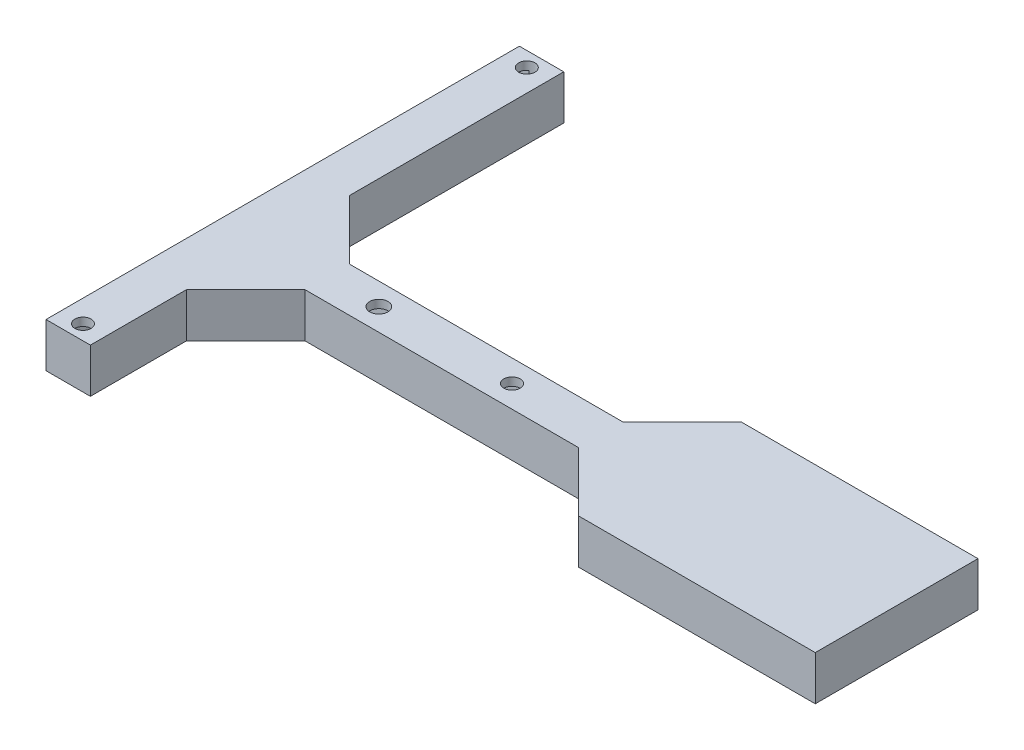
ISO-10303-21;
HEADER;
FILE_DESCRIPTION(('STEP AP214'),'2;1');
FILE_NAME('part.step','',(''),(''),'','','');
FILE_SCHEMA(('AUTOMOTIVE_DESIGN { 1 0 10303 214 1 1 1 1 }'));
ENDSEC;
DATA;
#1=APPLICATION_CONTEXT('core data for automotive mechanical design processes');
#2=APPLICATION_PROTOCOL_DEFINITION('international standard','automotive_design',2000,#1);
#3=PRODUCT_CONTEXT('',#1,'mechanical');
#4=PRODUCT('Part','Part','',(#3));
#5=PRODUCT_RELATED_PRODUCT_CATEGORY('part','',(#4));
#6=PRODUCT_DEFINITION_FORMATION('','',#4);
#7=PRODUCT_DEFINITION_CONTEXT('part definition',#1,'design');
#8=PRODUCT_DEFINITION('design','',#6,#7);
#9=PRODUCT_DEFINITION_SHAPE('','',#8);
#10=(LENGTH_UNIT() NAMED_UNIT(*) SI_UNIT(.MILLI.,.METRE.));
#11=(NAMED_UNIT(*) PLANE_ANGLE_UNIT() SI_UNIT($,.RADIAN.));
#12=(NAMED_UNIT(*) SI_UNIT($,.STERADIAN.) SOLID_ANGLE_UNIT());
#13=UNCERTAINTY_MEASURE_WITH_UNIT(LENGTH_MEASURE(1.E-05),#10,'distance_accuracy_value','');
#14=(GEOMETRIC_REPRESENTATION_CONTEXT(3) GLOBAL_UNCERTAINTY_ASSIGNED_CONTEXT((#13)) GLOBAL_UNIT_ASSIGNED_CONTEXT((#10,
#11,#12)) REPRESENTATION_CONTEXT('',''));
#15=CARTESIAN_POINT('',(0.,0.,0.));
#16=DIRECTION('',(0.,0.,1.));
#17=DIRECTION('',(1.,0.,0.));
#18=AXIS2_PLACEMENT_3D('',#15,#16,#17);
#19=CARTESIAN_POINT('',(0.,0.,0.));
#20=DIRECTION('',(0.,-1.,0.));
#21=DIRECTION('',(0.,0.,-1.));
#22=AXIS2_PLACEMENT_3D('',#19,#20,#21);
#23=PLANE('',#22);
#24=DIRECTION('',(-1.,0.,0.));
#25=VECTOR('',#24,1.);
#26=CARTESIAN_POINT('',(-80.,0.,-7.49999999999999));
#27=LINE('',#26,#25);
#28=CARTESIAN_POINT('',(-100.,0.,-7.49999999999999));
#29=VERTEX_POINT('',#28);
#30=CARTESIAN_POINT('',(-192.5,0.,-7.49999999999998));
#31=VERTEX_POINT('',#30);
#32=EDGE_CURVE('E343',#29,#31,#27,.T.);
#33=ORIENTED_EDGE('',*,*,#32,.F.);
#34=DIRECTION('',(-0.707106781186551,0.,0.707106781186544));
#35=VECTOR('',#34,1.);
#36=CARTESIAN_POINT('',(-100.,0.,-7.49999999999999));
#37=LINE('',#36,#35);
#38=CARTESIAN_POINT('',(-80.,0.,-27.5));
#39=VERTEX_POINT('',#38);
#40=EDGE_CURVE('E300',#29,#39,#37,.F.);
#41=ORIENTED_EDGE('',*,*,#40,.T.);
#42=DIRECTION('',(-1.,0.,0.));
#43=VECTOR('',#42,1.);
#44=CARTESIAN_POINT('',(-80.,0.,-27.5));
#45=LINE('',#44,#43);
#46=CARTESIAN_POINT('',(0.,0.,-27.5));
#47=VERTEX_POINT('',#46);
#48=EDGE_CURVE('E385',#47,#39,#45,.T.);
#49=ORIENTED_EDGE('',*,*,#48,.F.);
#50=DIRECTION('',(0.,0.,-1.));
#51=VECTOR('',#50,1.);
#52=CARTESIAN_POINT('',(0.,0.,-27.5));
#53=LINE('',#52,#51);
#54=CARTESIAN_POINT('',(0.,0.,27.5));
#55=VERTEX_POINT('',#54);
#56=EDGE_CURVE('E382',#55,#47,#53,.T.);
#57=ORIENTED_EDGE('',*,*,#56,.F.);
#58=DIRECTION('',(1.,0.,0.));
#59=VECTOR('',#58,1.);
#60=CARTESIAN_POINT('',(0.,0.,27.5));
#61=LINE('',#60,#59);
#62=CARTESIAN_POINT('',(-80.,0.,27.5));
#63=VERTEX_POINT('',#62);
#64=EDGE_CURVE('E378',#63,#55,#61,.T.);
#65=ORIENTED_EDGE('',*,*,#64,.F.);
#66=DIRECTION('',(0.707106781186544,0.,0.707106781186551));
#67=VECTOR('',#66,1.);
#68=CARTESIAN_POINT('',(-80.,0.,27.5000000000001));
#69=LINE('',#68,#67);
#70=CARTESIAN_POINT('',(-99.9999999999999,0.,7.50000000000002));
#71=VERTEX_POINT('',#70);
#72=EDGE_CURVE('E306',#63,#71,#69,.F.);
#73=ORIENTED_EDGE('',*,*,#72,.T.);
#74=DIRECTION('',(1.,0.,0.));
#75=VECTOR('',#74,1.);
#76=CARTESIAN_POINT('',(-80.,0.,7.50000000000002));
#77=LINE('',#76,#75);
#78=CARTESIAN_POINT('',(-192.5,0.,7.50000000000003));
#79=VERTEX_POINT('',#78);
#80=EDGE_CURVE('E374',#79,#71,#77,.T.);
#81=ORIENTED_EDGE('',*,*,#80,.F.);
#82=DIRECTION('',(0.707106781186551,0.,-0.707106781186544));
#83=VECTOR('',#82,1.);
#84=CARTESIAN_POINT('',(-192.5,0.,7.50000000000003));
#85=LINE('',#84,#83);
#86=CARTESIAN_POINT('',(-212.5,0.,27.5));
#87=VERTEX_POINT('',#86);
#88=EDGE_CURVE('E55',#79,#87,#85,.F.);
#89=ORIENTED_EDGE('',*,*,#88,.T.);
#90=DIRECTION('',(0.,0.,-1.));
#91=VECTOR('',#90,1.);
#92=CARTESIAN_POINT('',(-212.5,0.,7.50000000000003));
#93=LINE('',#92,#91);
#94=CARTESIAN_POINT('',(-212.5,0.,60.));
#95=VERTEX_POINT('',#94);
#96=EDGE_CURVE('E371',#95,#87,#93,.T.);
#97=ORIENTED_EDGE('',*,*,#96,.F.);
#98=DIRECTION('',(1.,0.,0.));
#99=VECTOR('',#98,1.);
#100=CARTESIAN_POINT('',(-212.5,0.,60.));
#101=LINE('',#100,#99);
#102=CARTESIAN_POINT('',(-227.5,0.,60.));
#103=VERTEX_POINT('',#102);
#104=EDGE_CURVE('E368',#103,#95,#101,.T.);
#105=ORIENTED_EDGE('',*,*,#104,.F.);
#106=DIRECTION('',(0.,0.,1.));
#107=VECTOR('',#106,1.);
#108=CARTESIAN_POINT('',(-227.5,0.,60.));
#109=LINE('',#108,#107);
#110=CARTESIAN_POINT('',(-227.5,0.,-100.));
#111=VERTEX_POINT('',#110);
#112=EDGE_CURVE('E365',#111,#103,#109,.T.);
#113=ORIENTED_EDGE('',*,*,#112,.F.);
#114=DIRECTION('',(-1.,0.,0.));
#115=VECTOR('',#114,1.);
#116=CARTESIAN_POINT('',(-227.5,0.,-100.));
#117=LINE('',#116,#115);
#118=CARTESIAN_POINT('',(-212.5,0.,-100.));
#119=VERTEX_POINT('',#118);
#120=EDGE_CURVE('E354',#119,#111,#117,.T.);
#121=ORIENTED_EDGE('',*,*,#120,.F.);
#122=DIRECTION('',(0.,0.,-1.));
#123=VECTOR('',#122,1.);
#124=CARTESIAN_POINT('',(-212.5,0.,-100.));
#125=LINE('',#124,#123);
#126=CARTESIAN_POINT('',(-212.5,0.,-27.5000000000002));
#127=VERTEX_POINT('',#126);
#128=EDGE_CURVE('E345',#127,#119,#125,.T.);
#129=ORIENTED_EDGE('',*,*,#128,.F.);
#130=DIRECTION('',(-0.707106781186543,0.,-0.707106781186552));
#131=VECTOR('',#130,1.);
#132=CARTESIAN_POINT('',(-212.5,0.,-27.5000000000001));
#133=LINE('',#132,#131);
#134=EDGE_CURVE('E312',#127,#31,#133,.F.);
#135=ORIENTED_EDGE('',*,*,#134,.T.);
#136=EDGE_LOOP('',(#33,#41,#49,#57,#65,#73,#81,#89,#97,#105,#113,#121,#129,#135));
#137=FACE_BOUND('',#136,.T.);
#138=DIRECTION('',(-1.,0.,0.));
#139=VECTOR('',#138,1.);
#140=CARTESIAN_POINT('',(0.,0.,-24.75));
#141=LINE('',#140,#139);
#142=CARTESIAN_POINT('',(-2.75000000000001,0.,-24.75));
#143=VERTEX_POINT('',#142);
#144=CARTESIAN_POINT('',(-77.25,0.,-24.75));
#145=VERTEX_POINT('',#144);
#146=EDGE_CURVE('E489',#143,#145,#141,.T.);
#147=ORIENTED_EDGE('',*,*,#146,.T.);
#148=DIRECTION('',(0.,0.,1.));
#149=VECTOR('',#148,1.);
#150=CARTESIAN_POINT('',(-77.25,0.,0.));
#151=LINE('',#150,#149);
#152=CARTESIAN_POINT('',(-77.25,0.,-4.74999999999999));
#153=VERTEX_POINT('',#152);
#154=EDGE_CURVE('E453',#145,#153,#151,.T.);
#155=ORIENTED_EDGE('',*,*,#154,.T.);
#156=DIRECTION('',(-1.,0.,0.));
#157=VECTOR('',#156,1.);
#158=CARTESIAN_POINT('',(0.,0.,-4.74999999999999));
#159=LINE('',#158,#157);
#160=CARTESIAN_POINT('',(-215.25,0.,-4.74999999999998));
#161=VERTEX_POINT('',#160);
#162=EDGE_CURVE('E448',#153,#161,#159,.T.);
#163=ORIENTED_EDGE('',*,*,#162,.T.);
#164=DIRECTION('',(0.,0.,-1.));
#165=VECTOR('',#164,1.);
#166=CARTESIAN_POINT('',(-215.25,0.,1.29175949216522E-13));
#167=LINE('',#166,#165);
#168=CARTESIAN_POINT('',(-215.25,0.,-97.25));
#169=VERTEX_POINT('',#168);
#170=EDGE_CURVE('E452',#161,#169,#167,.T.);
#171=ORIENTED_EDGE('',*,*,#170,.T.);
#172=DIRECTION('',(-1.,0.,0.));
#173=VECTOR('',#172,1.);
#174=CARTESIAN_POINT('',(0.,0.,-97.25));
#175=LINE('',#174,#173);
#176=CARTESIAN_POINT('',(-224.75,0.,-97.25));
#177=VERTEX_POINT('',#176);
#178=EDGE_CURVE('E457',#169,#177,#175,.T.);
#179=ORIENTED_EDGE('',*,*,#178,.T.);
#180=DIRECTION('',(0.,0.,1.));
#181=VECTOR('',#180,1.);
#182=CARTESIAN_POINT('',(-224.75,0.,0.));
#183=LINE('',#182,#181);
#184=CARTESIAN_POINT('',(-224.75,0.,57.25));
#185=VERTEX_POINT('',#184);
#186=EDGE_CURVE('E461',#177,#185,#183,.T.);
#187=ORIENTED_EDGE('',*,*,#186,.T.);
#188=DIRECTION('',(1.,0.,0.));
#189=VECTOR('',#188,1.);
#190=CARTESIAN_POINT('',(0.,0.,57.25));
#191=LINE('',#190,#189);
#192=CARTESIAN_POINT('',(-215.25,0.,57.25));
#193=VERTEX_POINT('',#192);
#194=EDGE_CURVE('E465',#185,#193,#191,.T.);
#195=ORIENTED_EDGE('',*,*,#194,.T.);
#196=DIRECTION('',(0.,0.,-1.));
#197=VECTOR('',#196,1.);
#198=CARTESIAN_POINT('',(-215.25,0.,0.));
#199=LINE('',#198,#197);
#200=CARTESIAN_POINT('',(-215.25,0.,4.75000000000003));
#201=VERTEX_POINT('',#200);
#202=EDGE_CURVE('E469',#193,#201,#199,.T.);
#203=ORIENTED_EDGE('',*,*,#202,.T.);
#204=DIRECTION('',(1.,0.,0.));
#205=VECTOR('',#204,1.);
#206=CARTESIAN_POINT('',(0.,0.,4.75000000000001));
#207=LINE('',#206,#205);
#208=CARTESIAN_POINT('',(-77.25,0.,4.75000000000002));
#209=VERTEX_POINT('',#208);
#210=EDGE_CURVE('E473',#201,#209,#207,.T.);
#211=ORIENTED_EDGE('',*,*,#210,.T.);
#212=DIRECTION('',(0.,0.,1.));
#213=VECTOR('',#212,1.);
#214=CARTESIAN_POINT('',(-77.25,0.,0.));
#215=LINE('',#214,#213);
#216=CARTESIAN_POINT('',(-77.25,0.,24.75));
#217=VERTEX_POINT('',#216);
#218=EDGE_CURVE('E477',#209,#217,#215,.T.);
#219=ORIENTED_EDGE('',*,*,#218,.T.);
#220=DIRECTION('',(1.,0.,0.));
#221=VECTOR('',#220,1.);
#222=CARTESIAN_POINT('',(0.,0.,24.75));
#223=LINE('',#222,#221);
#224=CARTESIAN_POINT('',(-2.74999999999999,0.,24.75));
#225=VERTEX_POINT('',#224);
#226=EDGE_CURVE('E481',#217,#225,#223,.T.);
#227=ORIENTED_EDGE('',*,*,#226,.T.);
#228=DIRECTION('',(0.,0.,-1.));
#229=VECTOR('',#228,1.);
#230=CARTESIAN_POINT('',(-2.75,0.,0.));
#231=LINE('',#230,#229);
#232=EDGE_CURVE('E485',#225,#143,#231,.T.);
#233=ORIENTED_EDGE('',*,*,#232,.T.);
#234=EDGE_LOOP('',(#147,#155,#163,#171,#179,#187,#195,#203,#211,#219,#227,#233));
#235=FACE_BOUND('',#234,.T.);
#236=ADVANCED_FACE('F45',(#137,#235),#23,.T.);
#237=CARTESIAN_POINT('',(-80.,15.,-7.49999999999999));
#238=DIRECTION('',(0.,0.,1.));
#239=DIRECTION('',(1.,0.,0.));
#240=AXIS2_PLACEMENT_3D('',#237,#238,#239);
#241=PLANE('',#240);
#242=DIRECTION('',(-1.,0.,0.));
#243=VECTOR('',#242,1.);
#244=CARTESIAN_POINT('',(-80.,15.,-7.49999999999999));
#245=LINE('',#244,#243);
#246=CARTESIAN_POINT('',(-100.,15.,-7.49999999999999));
#247=VERTEX_POINT('',#246);
#248=CARTESIAN_POINT('',(-192.5,15.,-7.49999999999998));
#249=VERTEX_POINT('',#248);
#250=EDGE_CURVE('E326',#247,#249,#245,.T.);
#251=ORIENTED_EDGE('',*,*,#250,.F.);
#252=DIRECTION('',(0.,-1.,0.));
#253=VECTOR('',#252,1.);
#254=CARTESIAN_POINT('',(-100.,0.,-7.49999999999999));
#255=LINE('',#254,#253);
#256=EDGE_CURVE('E283',#247,#29,#255,.T.);
#257=ORIENTED_EDGE('',*,*,#256,.T.);
#258=ORIENTED_EDGE('',*,*,#32,.T.);
#259=DIRECTION('',(0.,1.,0.));
#260=VECTOR('',#259,1.);
#261=CARTESIAN_POINT('',(-192.5,15.,-7.49999999999998));
#262=LINE('',#261,#260);
#263=EDGE_CURVE('E275',#31,#249,#262,.T.);
#264=ORIENTED_EDGE('',*,*,#263,.T.);
#265=EDGE_LOOP('',(#251,#257,#258,#264));
#266=FACE_BOUND('',#265,.T.);
#267=ADVANCED_FACE('F347',(#266),#241,.F.);
#268=CARTESIAN_POINT('',(-212.5,15.,-100.));
#269=DIRECTION('',(-1.,0.,0.));
#270=DIRECTION('',(0.,0.,1.));
#271=AXIS2_PLACEMENT_3D('',#268,#269,#270);
#272=PLANE('',#271);
#273=DIRECTION('',(0.,0.,-1.));
#274=VECTOR('',#273,1.);
#275=CARTESIAN_POINT('',(-212.5,15.,-100.));
#276=LINE('',#275,#274);
#277=CARTESIAN_POINT('',(-212.5,15.,-27.5000000000002));
#278=VERTEX_POINT('',#277);
#279=CARTESIAN_POINT('',(-212.5,15.,-100.));
#280=VERTEX_POINT('',#279);
#281=EDGE_CURVE('E323',#278,#280,#276,.T.);
#282=ORIENTED_EDGE('',*,*,#281,.F.);
#283=DIRECTION('',(0.,-1.,0.));
#284=VECTOR('',#283,1.);
#285=CARTESIAN_POINT('',(-212.5,0.,-27.5000000000002));
#286=LINE('',#285,#284);
#287=EDGE_CURVE('E294',#278,#127,#286,.T.);
#288=ORIENTED_EDGE('',*,*,#287,.T.);
#289=ORIENTED_EDGE('',*,*,#128,.T.);
#290=DIRECTION('',(0.,-1.,0.));
#291=VECTOR('',#290,1.);
#292=CARTESIAN_POINT('',(-212.5,15.,-100.));
#293=LINE('',#292,#291);
#294=EDGE_CURVE('E334',#280,#119,#293,.T.);
#295=ORIENTED_EDGE('',*,*,#294,.F.);
#296=EDGE_LOOP('',(#282,#288,#289,#295));
#297=FACE_BOUND('',#296,.T.);
#298=ADVANCED_FACE('F331',(#297),#272,.F.);
#299=CARTESIAN_POINT('',(-227.5,15.,-100.));
#300=DIRECTION('',(0.,0.,1.));
#301=DIRECTION('',(1.,0.,0.));
#302=AXIS2_PLACEMENT_3D('',#299,#300,#301);
#303=PLANE('',#302);
#304=ORIENTED_EDGE('',*,*,#120,.T.);
#305=DIRECTION('',(0.,-1.,0.));
#306=VECTOR('',#305,1.);
#307=CARTESIAN_POINT('',(-227.5,15.,-100.));
#308=LINE('',#307,#306);
#309=CARTESIAN_POINT('',(-227.5,15.,-100.));
#310=VERTEX_POINT('',#309);
#311=EDGE_CURVE('E413',#310,#111,#308,.T.);
#312=ORIENTED_EDGE('',*,*,#311,.F.);
#313=DIRECTION('',(-1.,0.,0.));
#314=VECTOR('',#313,1.);
#315=CARTESIAN_POINT('',(-227.5,15.,-100.));
#316=LINE('',#315,#314);
#317=EDGE_CURVE('E337',#280,#310,#316,.T.);
#318=ORIENTED_EDGE('',*,*,#317,.F.);
#319=ORIENTED_EDGE('',*,*,#294,.T.);
#320=EDGE_LOOP('',(#304,#312,#318,#319));
#321=FACE_BOUND('',#320,.T.);
#322=ADVANCED_FACE('F656',(#321),#303,.F.);
#323=CARTESIAN_POINT('',(-227.5,15.,60.));
#324=DIRECTION('',(1.,0.,0.));
#325=DIRECTION('',(0.,0.,-1.));
#326=AXIS2_PLACEMENT_3D('',#323,#324,#325);
#327=PLANE('',#326);
#328=ORIENTED_EDGE('',*,*,#112,.T.);
#329=DIRECTION('',(0.,-1.,0.));
#330=VECTOR('',#329,1.);
#331=CARTESIAN_POINT('',(-227.5,15.,60.));
#332=LINE('',#331,#330);
#333=CARTESIAN_POINT('',(-227.5,15.,60.));
#334=VERTEX_POINT('',#333);
#335=EDGE_CURVE('E409',#334,#103,#332,.T.);
#336=ORIENTED_EDGE('',*,*,#335,.F.);
#337=DIRECTION('',(0.,0.,1.));
#338=VECTOR('',#337,1.);
#339=CARTESIAN_POINT('',(-227.5,15.,60.));
#340=LINE('',#339,#338);
#341=EDGE_CURVE('E440',#310,#334,#340,.T.);
#342=ORIENTED_EDGE('',*,*,#341,.F.);
#343=ORIENTED_EDGE('',*,*,#311,.T.);
#344=EDGE_LOOP('',(#328,#336,#342,#343));
#345=FACE_BOUND('',#344,.T.);
#346=ADVANCED_FACE('F652',(#345),#327,.F.);
#347=CARTESIAN_POINT('',(-212.5,15.,60.));
#348=DIRECTION('',(0.,0.,-1.));
#349=DIRECTION('',(-1.,0.,0.));
#350=AXIS2_PLACEMENT_3D('',#347,#348,#349);
#351=PLANE('',#350);
#352=ORIENTED_EDGE('',*,*,#104,.T.);
#353=DIRECTION('',(0.,-1.,0.));
#354=VECTOR('',#353,1.);
#355=CARTESIAN_POINT('',(-212.5,15.,60.));
#356=LINE('',#355,#354);
#357=CARTESIAN_POINT('',(-212.5,15.,60.));
#358=VERTEX_POINT('',#357);
#359=EDGE_CURVE('E405',#358,#95,#356,.T.);
#360=ORIENTED_EDGE('',*,*,#359,.F.);
#361=DIRECTION('',(1.,0.,0.));
#362=VECTOR('',#361,1.);
#363=CARTESIAN_POINT('',(-212.5,15.,60.));
#364=LINE('',#363,#362);
#365=EDGE_CURVE('E437',#334,#358,#364,.T.);
#366=ORIENTED_EDGE('',*,*,#365,.F.);
#367=ORIENTED_EDGE('',*,*,#335,.T.);
#368=EDGE_LOOP('',(#352,#360,#366,#367));
#369=FACE_BOUND('',#368,.T.);
#370=ADVANCED_FACE('F649',(#369),#351,.F.);
#371=CARTESIAN_POINT('',(-212.5,15.,7.50000000000003));
#372=DIRECTION('',(-1.,0.,0.));
#373=DIRECTION('',(0.,0.,1.));
#374=AXIS2_PLACEMENT_3D('',#371,#372,#373);
#375=PLANE('',#374);
#376=ORIENTED_EDGE('',*,*,#96,.T.);
#377=DIRECTION('',(0.,1.,0.));
#378=VECTOR('',#377,1.);
#379=CARTESIAN_POINT('',(-212.5,15.,27.5));
#380=LINE('',#379,#378);
#381=CARTESIAN_POINT('',(-212.5,15.,27.5));
#382=VERTEX_POINT('',#381);
#383=EDGE_CURVE('E62',#87,#382,#380,.T.);
#384=ORIENTED_EDGE('',*,*,#383,.T.);
#385=DIRECTION('',(0.,0.,-1.));
#386=VECTOR('',#385,1.);
#387=CARTESIAN_POINT('',(-212.5,15.,7.50000000000003));
#388=LINE('',#387,#386);
#389=EDGE_CURVE('E434',#358,#382,#388,.T.);
#390=ORIENTED_EDGE('',*,*,#389,.F.);
#391=ORIENTED_EDGE('',*,*,#359,.T.);
#392=EDGE_LOOP('',(#376,#384,#390,#391));
#393=FACE_BOUND('',#392,.T.);
#394=ADVANCED_FACE('F645',(#393),#375,.F.);
#395=CARTESIAN_POINT('',(-80.,15.,7.50000000000002));
#396=DIRECTION('',(0.,0.,-1.));
#397=DIRECTION('',(-1.,0.,0.));
#398=AXIS2_PLACEMENT_3D('',#395,#396,#397);
#399=PLANE('',#398);
#400=ORIENTED_EDGE('',*,*,#80,.T.);
#401=DIRECTION('',(0.,1.,0.));
#402=VECTOR('',#401,1.);
#403=CARTESIAN_POINT('',(-99.9999999999999,15.,7.50000000000002));
#404=LINE('',#403,#402);
#405=CARTESIAN_POINT('',(-99.9999999999999,15.,7.50000000000002));
#406=VERTEX_POINT('',#405);
#407=EDGE_CURVE('E291',#71,#406,#404,.T.);
#408=ORIENTED_EDGE('',*,*,#407,.T.);
#409=DIRECTION('',(1.,0.,0.));
#410=VECTOR('',#409,1.);
#411=CARTESIAN_POINT('',(-80.,15.,7.50000000000002));
#412=LINE('',#411,#410);
#413=CARTESIAN_POINT('',(-192.5,15.,7.50000000000003));
#414=VERTEX_POINT('',#413);
#415=EDGE_CURVE('E430',#414,#406,#412,.T.);
#416=ORIENTED_EDGE('',*,*,#415,.F.);
#417=DIRECTION('',(0.,-1.,0.));
#418=VECTOR('',#417,1.);
#419=CARTESIAN_POINT('',(-192.5,0.,7.50000000000003));
#420=LINE('',#419,#418);
#421=EDGE_CURVE('E287',#414,#79,#420,.T.);
#422=ORIENTED_EDGE('',*,*,#421,.T.);
#423=EDGE_LOOP('',(#400,#408,#416,#422));
#424=FACE_BOUND('',#423,.T.);
#425=ADVANCED_FACE('F641',(#424),#399,.F.);
#426=CARTESIAN_POINT('',(0.,15.,27.5));
#427=DIRECTION('',(0.,0.,-1.));
#428=DIRECTION('',(-1.,0.,0.));
#429=AXIS2_PLACEMENT_3D('',#426,#427,#428);
#430=PLANE('',#429);
#431=ORIENTED_EDGE('',*,*,#64,.T.);
#432=DIRECTION('',(0.,-1.,0.));
#433=VECTOR('',#432,1.);
#434=CARTESIAN_POINT('',(0.,15.,27.5));
#435=LINE('',#434,#433);
#436=CARTESIAN_POINT('',(0.,15.,27.5));
#437=VERTEX_POINT('',#436);
#438=EDGE_CURVE('E397',#437,#55,#435,.T.);
#439=ORIENTED_EDGE('',*,*,#438,.F.);
#440=DIRECTION('',(1.,0.,0.));
#441=VECTOR('',#440,1.);
#442=CARTESIAN_POINT('',(0.,15.,27.5));
#443=LINE('',#442,#441);
#444=CARTESIAN_POINT('',(-80.,15.,27.5));
#445=VERTEX_POINT('',#444);
#446=EDGE_CURVE('E428',#445,#437,#443,.T.);
#447=ORIENTED_EDGE('',*,*,#446,.F.);
#448=DIRECTION('',(0.,-1.,0.));
#449=VECTOR('',#448,1.);
#450=CARTESIAN_POINT('',(-80.,15.,27.5));
#451=LINE('',#450,#449);
#452=EDGE_CURVE('E401',#445,#63,#451,.T.);
#453=ORIENTED_EDGE('',*,*,#452,.T.);
#454=EDGE_LOOP('',(#431,#439,#447,#453));
#455=FACE_BOUND('',#454,.T.);
#456=ADVANCED_FACE('F637',(#455),#430,.F.);
#457=CARTESIAN_POINT('',(0.,15.,-27.5));
#458=DIRECTION('',(-1.,0.,0.));
#459=DIRECTION('',(0.,0.,1.));
#460=AXIS2_PLACEMENT_3D('',#457,#458,#459);
#461=PLANE('',#460);
#462=ORIENTED_EDGE('',*,*,#56,.T.);
#463=DIRECTION('',(0.,-1.,0.));
#464=VECTOR('',#463,1.);
#465=CARTESIAN_POINT('',(0.,15.,-27.5));
#466=LINE('',#465,#464);
#467=CARTESIAN_POINT('',(0.,15.,-27.5));
#468=VERTEX_POINT('',#467);
#469=EDGE_CURVE('E393',#468,#47,#466,.T.);
#470=ORIENTED_EDGE('',*,*,#469,.F.);
#471=DIRECTION('',(0.,0.,-1.));
#472=VECTOR('',#471,1.);
#473=CARTESIAN_POINT('',(0.,15.,7.50000000000001));
#474=LINE('',#473,#472);
#475=EDGE_CURVE('E426',#437,#468,#474,.T.);
#476=ORIENTED_EDGE('',*,*,#475,.F.);
#477=ORIENTED_EDGE('',*,*,#438,.T.);
#478=EDGE_LOOP('',(#462,#470,#476,#477));
#479=FACE_BOUND('',#478,.T.);
#480=ADVANCED_FACE('F633',(#479),#461,.F.);
#481=CARTESIAN_POINT('',(-80.,15.,-27.5));
#482=DIRECTION('',(0.,0.,1.));
#483=DIRECTION('',(1.,0.,0.));
#484=AXIS2_PLACEMENT_3D('',#481,#482,#483);
#485=PLANE('',#484);
#486=ORIENTED_EDGE('',*,*,#48,.T.);
#487=DIRECTION('',(0.,-1.,0.));
#488=VECTOR('',#487,1.);
#489=CARTESIAN_POINT('',(-80.,15.,-27.5));
#490=LINE('',#489,#488);
#491=CARTESIAN_POINT('',(-80.,15.,-27.5));
#492=VERTEX_POINT('',#491);
#493=EDGE_CURVE('E389',#492,#39,#490,.T.);
#494=ORIENTED_EDGE('',*,*,#493,.F.);
#495=DIRECTION('',(-1.,0.,0.));
#496=VECTOR('',#495,1.);
#497=CARTESIAN_POINT('',(-80.,15.,-27.5));
#498=LINE('',#497,#496);
#499=EDGE_CURVE('E360',#468,#492,#498,.T.);
#500=ORIENTED_EDGE('',*,*,#499,.F.);
#501=ORIENTED_EDGE('',*,*,#469,.T.);
#502=EDGE_LOOP('',(#486,#494,#500,#501));
#503=FACE_BOUND('',#502,.T.);
#504=ADVANCED_FACE('F601',(#503),#485,.F.);
#505=CARTESIAN_POINT('',(0.,15.,0.));
#506=DIRECTION('',(0.,-1.,0.));
#507=DIRECTION('',(0.,0.,-1.));
#508=AXIS2_PLACEMENT_3D('',#505,#506,#507);
#509=PLANE('',#508);
#510=CARTESIAN_POINT('',(-130.,15.,0.));
#511=DIRECTION('',(0.,1.,0.));
#512=DIRECTION('',(0.,0.,1.));
#513=AXIS2_PLACEMENT_3D('',#510,#511,#512);
#514=CIRCLE('',#513,2.75000000000001);
#515=CARTESIAN_POINT('',(-130.,15.,2.75000000000001));
#516=VERTEX_POINT('',#515);
#517=EDGE_CURVE('E422',#516,#516,#514,.T.);
#518=ORIENTED_EDGE('',*,*,#517,.F.);
#519=EDGE_LOOP('',(#518));
#520=FACE_BOUND('',#519,.T.);
#521=CARTESIAN_POINT('',(-220.,15.,-95.));
#522=DIRECTION('',(0.,1.,0.));
#523=DIRECTION('',(0.,0.,1.));
#524=AXIS2_PLACEMENT_3D('',#521,#522,#523);
#525=CIRCLE('',#524,2.75000000000001);
#526=CARTESIAN_POINT('',(-220.,15.,-92.25));
#527=VERTEX_POINT('',#526);
#528=EDGE_CURVE('E588',#527,#527,#525,.T.);
#529=ORIENTED_EDGE('',*,*,#528,.F.);
#530=EDGE_LOOP('',(#529));
#531=FACE_BOUND('',#530,.T.);
#532=CARTESIAN_POINT('',(-220.,15.,55.));
#533=DIRECTION('',(0.,1.,0.));
#534=DIRECTION('',(0.,0.,1.));
#535=AXIS2_PLACEMENT_3D('',#532,#533,#534);
#536=CIRCLE('',#535,2.75000000000001);
#537=CARTESIAN_POINT('',(-220.,15.,57.75));
#538=VERTEX_POINT('',#537);
#539=EDGE_CURVE('E263',#538,#538,#536,.T.);
#540=ORIENTED_EDGE('',*,*,#539,.F.);
#541=EDGE_LOOP('',(#540));
#542=FACE_BOUND('',#541,.T.);
#543=CARTESIAN_POINT('',(-175.,15.,0.));
#544=DIRECTION('',(0.,1.,0.));
#545=DIRECTION('',(0.,0.,1.));
#546=AXIS2_PLACEMENT_3D('',#543,#544,#545);
#547=CIRCLE('',#546,3.07180361541038);
#548=CARTESIAN_POINT('',(-175.,15.,3.07180361541038));
#549=VERTEX_POINT('',#548);
#550=EDGE_CURVE('E264',#549,#549,#547,.T.);
#551=ORIENTED_EDGE('',*,*,#550,.F.);
#552=EDGE_LOOP('',(#551));
#553=FACE_BOUND('',#552,.T.);
#554=ORIENTED_EDGE('',*,*,#499,.T.);
#555=DIRECTION('',(0.707106781186551,0.,-0.707106781186544));
#556=VECTOR('',#555,1.);
#557=CARTESIAN_POINT('',(-53.7499999999995,15.,-53.7500000000001));
#558=LINE('',#557,#556);
#559=EDGE_CURVE('E303',#492,#247,#558,.F.);
#560=ORIENTED_EDGE('',*,*,#559,.T.);
#561=ORIENTED_EDGE('',*,*,#250,.T.);
#562=DIRECTION('',(0.707106781186543,0.,0.707106781186552));
#563=VECTOR('',#562,1.);
#564=CARTESIAN_POINT('',(-92.5000000000011,15.,92.5));
#565=LINE('',#564,#563);
#566=EDGE_CURVE('E315',#249,#278,#565,.F.);
#567=ORIENTED_EDGE('',*,*,#566,.T.);
#568=ORIENTED_EDGE('',*,*,#281,.T.);
#569=ORIENTED_EDGE('',*,*,#317,.T.);
#570=ORIENTED_EDGE('',*,*,#341,.T.);
#571=ORIENTED_EDGE('',*,*,#365,.T.);
#572=ORIENTED_EDGE('',*,*,#389,.T.);
#573=DIRECTION('',(-0.707106781186551,0.,0.707106781186544));
#574=VECTOR('',#573,1.);
#575=CARTESIAN_POINT('',(-92.4999999999988,15.,-92.4999999999998));
#576=LINE('',#575,#574);
#577=EDGE_CURVE('E11',#382,#414,#576,.F.);
#578=ORIENTED_EDGE('',*,*,#577,.T.);
#579=ORIENTED_EDGE('',*,*,#415,.T.);
#580=DIRECTION('',(-0.707106781186544,0.,-0.707106781186551));
#581=VECTOR('',#580,1.);
#582=CARTESIAN_POINT('',(-53.7500000000005,15.,53.7499999999999));
#583=LINE('',#582,#581);
#584=EDGE_CURVE('E309',#406,#445,#583,.F.);
#585=ORIENTED_EDGE('',*,*,#584,.T.);
#586=ORIENTED_EDGE('',*,*,#446,.T.);
#587=ORIENTED_EDGE('',*,*,#475,.T.);
#588=EDGE_LOOP('',(#554,#560,#561,#567,#568,#569,#570,#571,#572,#578,#579,#585,#586,#587));
#589=FACE_BOUND('',#588,.T.);
#590=ADVANCED_FACE('F322',(#520,#531,#542,#553,#589),#509,.F.);
#591=CARTESIAN_POINT('',(-77.25,15.,-7.49999999999999));
#592=DIRECTION('',(1.,0.,0.));
#593=DIRECTION('',(0.,0.,-1.));
#594=AXIS2_PLACEMENT_3D('',#591,#592,#593);
#595=PLANE('',#594);
#596=ORIENTED_EDGE('',*,*,#154,.F.);
#597=DIRECTION('',(0.,-1.,0.));
#598=VECTOR('',#597,1.);
#599=CARTESIAN_POINT('',(-77.25,15.,-24.75));
#600=LINE('',#599,#598);
#601=CARTESIAN_POINT('',(-77.25,12.25,-24.75));
#602=VERTEX_POINT('',#601);
#603=EDGE_CURVE('E500',#602,#145,#600,.T.);
#604=ORIENTED_EDGE('',*,*,#603,.F.);
#605=DIRECTION('',(0.,0.,1.));
#606=VECTOR('',#605,1.);
#607=CARTESIAN_POINT('',(-77.25,12.25,0.));
#608=LINE('',#607,#606);
#609=CARTESIAN_POINT('',(-77.25,12.25,-4.74999999999999));
#610=VERTEX_POINT('',#609);
#611=EDGE_CURVE('E493',#602,#610,#608,.T.);
#612=ORIENTED_EDGE('',*,*,#611,.T.);
#613=DIRECTION('',(0.,-1.,0.));
#614=VECTOR('',#613,1.);
#615=CARTESIAN_POINT('',(-77.25,15.,-4.74999999999999));
#616=LINE('',#615,#614);
#617=EDGE_CURVE('E350',#610,#153,#616,.T.);
#618=ORIENTED_EDGE('',*,*,#617,.T.);
#619=EDGE_LOOP('',(#596,#604,#612,#618));
#620=FACE_BOUND('',#619,.T.);
#621=ADVANCED_FACE('F600',(#620),#595,.T.);
#622=CARTESIAN_POINT('',(-80.,15.,-4.74999999999999));
#623=DIRECTION('',(0.,0.,1.));
#624=DIRECTION('',(1.,0.,0.));
#625=AXIS2_PLACEMENT_3D('',#622,#623,#624);
#626=PLANE('',#625);
#627=ORIENTED_EDGE('',*,*,#162,.F.);
#628=ORIENTED_EDGE('',*,*,#617,.F.);
#629=DIRECTION('',(-1.,0.,0.));
#630=VECTOR('',#629,1.);
#631=CARTESIAN_POINT('',(0.,12.25,-4.74999999999999));
#632=LINE('',#631,#630);
#633=CARTESIAN_POINT('',(-215.25,12.25,-4.74999999999998));
#634=VERTEX_POINT('',#633);
#635=EDGE_CURVE('E557',#610,#634,#632,.T.);
#636=ORIENTED_EDGE('',*,*,#635,.T.);
#637=DIRECTION('',(0.,-1.,0.));
#638=VECTOR('',#637,1.);
#639=CARTESIAN_POINT('',(-215.25,15.,-4.74999999999998));
#640=LINE('',#639,#638);
#641=EDGE_CURVE('E357',#634,#161,#640,.T.);
#642=ORIENTED_EDGE('',*,*,#641,.T.);
#643=EDGE_LOOP('',(#627,#628,#636,#642));
#644=FACE_BOUND('',#643,.T.);
#645=ADVANCED_FACE('F953',(#644),#626,.T.);
#646=CARTESIAN_POINT('',(-215.25,15.,-100.));
#647=DIRECTION('',(-1.,0.,0.));
#648=DIRECTION('',(0.,0.,1.));
#649=AXIS2_PLACEMENT_3D('',#646,#647,#648);
#650=PLANE('',#649);
#651=ORIENTED_EDGE('',*,*,#170,.F.);
#652=ORIENTED_EDGE('',*,*,#641,.F.);
#653=DIRECTION('',(0.,0.,-1.));
#654=VECTOR('',#653,1.);
#655=CARTESIAN_POINT('',(-215.25,12.25,1.29175949216522E-13));
#656=LINE('',#655,#654);
#657=CARTESIAN_POINT('',(-215.25,12.25,-97.25));
#658=VERTEX_POINT('',#657);
#659=EDGE_CURVE('E554',#634,#658,#656,.T.);
#660=ORIENTED_EDGE('',*,*,#659,.T.);
#661=DIRECTION('',(0.,-1.,0.));
#662=VECTOR('',#661,1.);
#663=CARTESIAN_POINT('',(-215.25,15.,-97.25));
#664=LINE('',#663,#662);
#665=EDGE_CURVE('E553',#658,#169,#664,.T.);
#666=ORIENTED_EDGE('',*,*,#665,.T.);
#667=EDGE_LOOP('',(#651,#652,#660,#666));
#668=FACE_BOUND('',#667,.T.);
#669=ADVANCED_FACE('F873',(#668),#650,.T.);
#670=CARTESIAN_POINT('',(-227.5,15.,-97.25));
#671=DIRECTION('',(0.,0.,1.));
#672=DIRECTION('',(1.,0.,0.));
#673=AXIS2_PLACEMENT_3D('',#670,#671,#672);
#674=PLANE('',#673);
#675=DIRECTION('',(0.,1.,0.));
#676=VECTOR('',#675,1.);
#677=CARTESIAN_POINT('',(-218.418861169916,5.,-97.25));
#678=LINE('',#677,#676);
#679=CARTESIAN_POINT('',(-218.418861169916,5.,-97.25));
#680=VERTEX_POINT('',#679);
#681=CARTESIAN_POINT('',(-218.418861169916,12.25,-97.25));
#682=VERTEX_POINT('',#681);
#683=EDGE_CURVE('E570',#680,#682,#678,.T.);
#684=ORIENTED_EDGE('',*,*,#683,.F.);
#685=DIRECTION('',(-1.,0.,0.));
#686=VECTOR('',#685,1.);
#687=CARTESIAN_POINT('',(-227.5,5.,-97.25));
#688=LINE('',#687,#686);
#689=CARTESIAN_POINT('',(-221.581138830084,5.,-97.25));
#690=VERTEX_POINT('',#689);
#691=EDGE_CURVE('E269',#680,#690,#688,.T.);
#692=ORIENTED_EDGE('',*,*,#691,.T.);
#693=DIRECTION('',(0.,1.,0.));
#694=VECTOR('',#693,1.);
#695=CARTESIAN_POINT('',(-221.581138830084,5.,-97.25));
#696=LINE('',#695,#694);
#697=CARTESIAN_POINT('',(-221.581138830084,12.25,-97.25));
#698=VERTEX_POINT('',#697);
#699=EDGE_CURVE('E573',#698,#690,#696,.F.);
#700=ORIENTED_EDGE('',*,*,#699,.F.);
#701=DIRECTION('',(-1.,0.,0.));
#702=VECTOR('',#701,1.);
#703=CARTESIAN_POINT('',(0.,12.25,-97.25));
#704=LINE('',#703,#702);
#705=CARTESIAN_POINT('',(-224.75,12.25,-97.25));
#706=VERTEX_POINT('',#705);
#707=EDGE_CURVE('E550',#698,#706,#704,.T.);
#708=ORIENTED_EDGE('',*,*,#707,.T.);
#709=DIRECTION('',(0.,-1.,0.));
#710=VECTOR('',#709,1.);
#711=CARTESIAN_POINT('',(-224.75,15.,-97.25));
#712=LINE('',#711,#710);
#713=EDGE_CURVE('E546',#706,#177,#712,.T.);
#714=ORIENTED_EDGE('',*,*,#713,.T.);
#715=ORIENTED_EDGE('',*,*,#178,.F.);
#716=ORIENTED_EDGE('',*,*,#665,.F.);
#717=EDGE_CURVE('E543',#658,#682,#704,.T.);
#718=ORIENTED_EDGE('',*,*,#717,.T.);
#719=EDGE_LOOP('',(#684,#692,#700,#708,#714,#715,#716,#718));
#720=FACE_BOUND('',#719,.T.);
#721=ADVANCED_FACE('F868',(#720),#674,.T.);
#722=CARTESIAN_POINT('',(-224.75,15.,60.));
#723=DIRECTION('',(1.,0.,0.));
#724=DIRECTION('',(0.,0.,-1.));
#725=AXIS2_PLACEMENT_3D('',#722,#723,#724);
#726=PLANE('',#725);
#727=ORIENTED_EDGE('',*,*,#186,.F.);
#728=ORIENTED_EDGE('',*,*,#713,.F.);
#729=DIRECTION('',(0.,0.,1.));
#730=VECTOR('',#729,1.);
#731=CARTESIAN_POINT('',(-224.75,12.25,0.));
#732=LINE('',#731,#730);
#733=CARTESIAN_POINT('',(-224.75,12.25,57.25));
#734=VERTEX_POINT('',#733);
#735=EDGE_CURVE('E540',#706,#734,#732,.T.);
#736=ORIENTED_EDGE('',*,*,#735,.T.);
#737=DIRECTION('',(0.,-1.,0.));
#738=VECTOR('',#737,1.);
#739=CARTESIAN_POINT('',(-224.75,15.,57.25));
#740=LINE('',#739,#738);
#741=EDGE_CURVE('E539',#734,#185,#740,.T.);
#742=ORIENTED_EDGE('',*,*,#741,.T.);
#743=EDGE_LOOP('',(#727,#728,#736,#742));
#744=FACE_BOUND('',#743,.T.);
#745=ADVANCED_FACE('F858',(#744),#726,.T.);
#746=CARTESIAN_POINT('',(-212.5,15.,57.25));
#747=DIRECTION('',(0.,0.,-1.));
#748=DIRECTION('',(-1.,0.,0.));
#749=AXIS2_PLACEMENT_3D('',#746,#747,#748);
#750=PLANE('',#749);
#751=DIRECTION('',(0.,1.,0.));
#752=VECTOR('',#751,1.);
#753=CARTESIAN_POINT('',(-221.581138830084,5.,57.25));
#754=LINE('',#753,#752);
#755=CARTESIAN_POINT('',(-221.581138830084,5.,57.25));
#756=VERTEX_POINT('',#755);
#757=CARTESIAN_POINT('',(-221.581138830084,12.25,57.25));
#758=VERTEX_POINT('',#757);
#759=EDGE_CURVE('E256',#756,#758,#754,.T.);
#760=ORIENTED_EDGE('',*,*,#759,.F.);
#761=DIRECTION('',(1.,0.,0.));
#762=VECTOR('',#761,1.);
#763=CARTESIAN_POINT('',(-212.5,5.,57.25));
#764=LINE('',#763,#762);
#765=CARTESIAN_POINT('',(-218.418861169916,5.,57.25));
#766=VERTEX_POINT('',#765);
#767=EDGE_CURVE('E261',#756,#766,#764,.T.);
#768=ORIENTED_EDGE('',*,*,#767,.T.);
#769=DIRECTION('',(0.,1.,0.));
#770=VECTOR('',#769,1.);
#771=CARTESIAN_POINT('',(-218.418861169916,5.,57.25));
#772=LINE('',#771,#770);
#773=CARTESIAN_POINT('',(-218.418861169916,12.25,57.25));
#774=VERTEX_POINT('',#773);
#775=EDGE_CURVE('E244',#774,#766,#772,.F.);
#776=ORIENTED_EDGE('',*,*,#775,.F.);
#777=DIRECTION('',(1.,0.,0.));
#778=VECTOR('',#777,1.);
#779=CARTESIAN_POINT('',(0.,12.25,57.25));
#780=LINE('',#779,#778);
#781=CARTESIAN_POINT('',(-215.25,12.25,57.25));
#782=VERTEX_POINT('',#781);
#783=EDGE_CURVE('E536',#774,#782,#780,.T.);
#784=ORIENTED_EDGE('',*,*,#783,.T.);
#785=DIRECTION('',(0.,-1.,0.));
#786=VECTOR('',#785,1.);
#787=CARTESIAN_POINT('',(-215.25,15.,57.25));
#788=LINE('',#787,#786);
#789=EDGE_CURVE('E533',#782,#193,#788,.T.);
#790=ORIENTED_EDGE('',*,*,#789,.T.);
#791=ORIENTED_EDGE('',*,*,#194,.F.);
#792=ORIENTED_EDGE('',*,*,#741,.F.);
#793=EDGE_CURVE('E530',#734,#758,#780,.T.);
#794=ORIENTED_EDGE('',*,*,#793,.T.);
#795=EDGE_LOOP('',(#760,#768,#776,#784,#790,#791,#792,#794));
#796=FACE_BOUND('',#795,.T.);
#797=ADVANCED_FACE('F266',(#796),#750,.T.);
#798=CARTESIAN_POINT('',(-215.25,15.,7.50000000000003));
#799=DIRECTION('',(-1.,0.,0.));
#800=DIRECTION('',(0.,0.,1.));
#801=AXIS2_PLACEMENT_3D('',#798,#799,#800);
#802=PLANE('',#801);
#803=ORIENTED_EDGE('',*,*,#202,.F.);
#804=ORIENTED_EDGE('',*,*,#789,.F.);
#805=DIRECTION('',(0.,0.,-1.));
#806=VECTOR('',#805,1.);
#807=CARTESIAN_POINT('',(-215.25,12.25,0.));
#808=LINE('',#807,#806);
#809=CARTESIAN_POINT('',(-215.25,12.25,4.75000000000003));
#810=VERTEX_POINT('',#809);
#811=EDGE_CURVE('E524',#782,#810,#808,.T.);
#812=ORIENTED_EDGE('',*,*,#811,.T.);
#813=DIRECTION('',(0.,-1.,0.));
#814=VECTOR('',#813,1.);
#815=CARTESIAN_POINT('',(-215.25,15.,4.75000000000003));
#816=LINE('',#815,#814);
#817=EDGE_CURVE('E527',#810,#201,#816,.T.);
#818=ORIENTED_EDGE('',*,*,#817,.T.);
#819=EDGE_LOOP('',(#803,#804,#812,#818));
#820=FACE_BOUND('',#819,.T.);
#821=ADVANCED_FACE('F857',(#820),#802,.T.);
#822=CARTESIAN_POINT('',(-80.,15.,4.75000000000002));
#823=DIRECTION('',(0.,0.,-1.));
#824=DIRECTION('',(-1.,0.,0.));
#825=AXIS2_PLACEMENT_3D('',#822,#823,#824);
#826=PLANE('',#825);
#827=ORIENTED_EDGE('',*,*,#210,.F.);
#828=ORIENTED_EDGE('',*,*,#817,.F.);
#829=DIRECTION('',(1.,0.,0.));
#830=VECTOR('',#829,1.);
#831=CARTESIAN_POINT('',(0.,12.25,4.75000000000001));
#832=LINE('',#831,#830);
#833=CARTESIAN_POINT('',(-77.25,12.25,4.75000000000002));
#834=VERTEX_POINT('',#833);
#835=EDGE_CURVE('E518',#810,#834,#832,.T.);
#836=ORIENTED_EDGE('',*,*,#835,.T.);
#837=DIRECTION('',(0.,-1.,0.));
#838=VECTOR('',#837,1.);
#839=CARTESIAN_POINT('',(-77.25,15.,4.75000000000002));
#840=LINE('',#839,#838);
#841=EDGE_CURVE('E521',#834,#209,#840,.T.);
#842=ORIENTED_EDGE('',*,*,#841,.T.);
#843=EDGE_LOOP('',(#827,#828,#836,#842));
#844=FACE_BOUND('',#843,.T.);
#845=ADVANCED_FACE('F918',(#844),#826,.T.);
#846=CARTESIAN_POINT('',(-77.25,15.,27.5));
#847=DIRECTION('',(1.,0.,0.));
#848=DIRECTION('',(0.,0.,-1.));
#849=AXIS2_PLACEMENT_3D('',#846,#847,#848);
#850=PLANE('',#849);
#851=ORIENTED_EDGE('',*,*,#218,.F.);
#852=ORIENTED_EDGE('',*,*,#841,.F.);
#853=DIRECTION('',(0.,0.,1.));
#854=VECTOR('',#853,1.);
#855=CARTESIAN_POINT('',(-77.25,12.25,0.));
#856=LINE('',#855,#854);
#857=CARTESIAN_POINT('',(-77.25,12.25,24.75));
#858=VERTEX_POINT('',#857);
#859=EDGE_CURVE('E511',#834,#858,#856,.T.);
#860=ORIENTED_EDGE('',*,*,#859,.T.);
#861=DIRECTION('',(0.,-1.,0.));
#862=VECTOR('',#861,1.);
#863=CARTESIAN_POINT('',(-77.25,15.,24.75));
#864=LINE('',#863,#862);
#865=EDGE_CURVE('E515',#858,#217,#864,.T.);
#866=ORIENTED_EDGE('',*,*,#865,.T.);
#867=EDGE_LOOP('',(#851,#852,#860,#866));
#868=FACE_BOUND('',#867,.T.);
#869=ADVANCED_FACE('F906',(#868),#850,.T.);
#870=CARTESIAN_POINT('',(0.,15.,24.75));
#871=DIRECTION('',(0.,0.,-1.));
#872=DIRECTION('',(-1.,0.,0.));
#873=AXIS2_PLACEMENT_3D('',#870,#871,#872);
#874=PLANE('',#873);
#875=ORIENTED_EDGE('',*,*,#226,.F.);
#876=ORIENTED_EDGE('',*,*,#865,.F.);
#877=DIRECTION('',(1.,0.,0.));
#878=VECTOR('',#877,1.);
#879=CARTESIAN_POINT('',(0.,12.25,24.75));
#880=LINE('',#879,#878);
#881=CARTESIAN_POINT('',(-2.74999999999999,12.25,24.75));
#882=VERTEX_POINT('',#881);
#883=EDGE_CURVE('E504',#858,#882,#880,.T.);
#884=ORIENTED_EDGE('',*,*,#883,.T.);
#885=DIRECTION('',(0.,-1.,0.));
#886=VECTOR('',#885,1.);
#887=CARTESIAN_POINT('',(-2.74999999999999,15.,24.75));
#888=LINE('',#887,#886);
#889=EDGE_CURVE('E508',#882,#225,#888,.T.);
#890=ORIENTED_EDGE('',*,*,#889,.T.);
#891=EDGE_LOOP('',(#875,#876,#884,#890));
#892=FACE_BOUND('',#891,.T.);
#893=ADVANCED_FACE('F895',(#892),#874,.T.);
#894=CARTESIAN_POINT('',(-2.75000000000001,15.,-27.5));
#895=DIRECTION('',(-1.,0.,0.));
#896=DIRECTION('',(0.,0.,1.));
#897=AXIS2_PLACEMENT_3D('',#894,#895,#896);
#898=PLANE('',#897);
#899=ORIENTED_EDGE('',*,*,#232,.F.);
#900=ORIENTED_EDGE('',*,*,#889,.F.);
#901=DIRECTION('',(0.,0.,-1.));
#902=VECTOR('',#901,1.);
#903=CARTESIAN_POINT('',(-2.75,12.25,0.));
#904=LINE('',#903,#902);
#905=CARTESIAN_POINT('',(-2.75000000000001,12.25,-24.75));
#906=VERTEX_POINT('',#905);
#907=EDGE_CURVE('E501',#882,#906,#904,.T.);
#908=ORIENTED_EDGE('',*,*,#907,.T.);
#909=DIRECTION('',(0.,-1.,0.));
#910=VECTOR('',#909,1.);
#911=CARTESIAN_POINT('',(-2.75,15.,-24.75));
#912=LINE('',#911,#910);
#913=EDGE_CURVE('E505',#906,#143,#912,.T.);
#914=ORIENTED_EDGE('',*,*,#913,.T.);
#915=EDGE_LOOP('',(#899,#900,#908,#914));
#916=FACE_BOUND('',#915,.T.);
#917=ADVANCED_FACE('F884',(#916),#898,.T.);
#918=CARTESIAN_POINT('',(-80.,15.,-24.75));
#919=DIRECTION('',(0.,0.,1.));
#920=DIRECTION('',(1.,0.,0.));
#921=AXIS2_PLACEMENT_3D('',#918,#919,#920);
#922=PLANE('',#921);
#923=ORIENTED_EDGE('',*,*,#146,.F.);
#924=ORIENTED_EDGE('',*,*,#913,.F.);
#925=DIRECTION('',(-1.,0.,0.));
#926=VECTOR('',#925,1.);
#927=CARTESIAN_POINT('',(0.,12.25,-24.75));
#928=LINE('',#927,#926);
#929=EDGE_CURVE('E497',#906,#602,#928,.T.);
#930=ORIENTED_EDGE('',*,*,#929,.T.);
#931=ORIENTED_EDGE('',*,*,#603,.T.);
#932=EDGE_LOOP('',(#923,#924,#930,#931));
#933=FACE_BOUND('',#932,.T.);
#934=ADVANCED_FACE('F619',(#933),#922,.T.);
#935=CARTESIAN_POINT('',(0.,12.25,0.));
#936=DIRECTION('',(0.,-1.,0.));
#937=DIRECTION('',(0.,0.,-1.));
#938=AXIS2_PLACEMENT_3D('',#935,#936,#937);
#939=PLANE('',#938);
#940=CARTESIAN_POINT('',(-130.,12.25,0.));
#941=DIRECTION('',(0.,-1.,0.));
#942=DIRECTION('',(0.,0.,-1.));
#943=AXIS2_PLACEMENT_3D('',#940,#941,#942);
#944=CIRCLE('',#943,2.75000000000001);
#945=CARTESIAN_POINT('',(-130.,12.25,-2.75000000000001));
#946=VERTEX_POINT('',#945);
#947=EDGE_CURVE('E279',#946,#946,#944,.T.);
#948=ORIENTED_EDGE('',*,*,#947,.F.);
#949=EDGE_LOOP('',(#948));
#950=FACE_BOUND('',#949,.T.);
#951=CARTESIAN_POINT('',(-220.,12.25,-95.));
#952=DIRECTION('',(0.,-1.,0.));
#953=DIRECTION('',(0.,0.,-1.));
#954=AXIS2_PLACEMENT_3D('',#951,#952,#953);
#955=CIRCLE('',#954,2.75000000000001);
#956=EDGE_CURVE('E270',#682,#698,#955,.T.);
#957=ORIENTED_EDGE('',*,*,#956,.F.);
#958=ORIENTED_EDGE('',*,*,#717,.F.);
#959=ORIENTED_EDGE('',*,*,#659,.F.);
#960=ORIENTED_EDGE('',*,*,#635,.F.);
#961=ORIENTED_EDGE('',*,*,#611,.F.);
#962=ORIENTED_EDGE('',*,*,#929,.F.);
#963=ORIENTED_EDGE('',*,*,#907,.F.);
#964=ORIENTED_EDGE('',*,*,#883,.F.);
#965=ORIENTED_EDGE('',*,*,#859,.F.);
#966=ORIENTED_EDGE('',*,*,#835,.F.);
#967=ORIENTED_EDGE('',*,*,#811,.F.);
#968=ORIENTED_EDGE('',*,*,#783,.F.);
#969=CARTESIAN_POINT('',(-220.,12.25,55.));
#970=DIRECTION('',(0.,-1.,0.));
#971=DIRECTION('',(0.,0.,-1.));
#972=AXIS2_PLACEMENT_3D('',#969,#970,#971);
#973=CIRCLE('',#972,2.75000000000001);
#974=EDGE_CURVE('E251',#758,#774,#973,.T.);
#975=ORIENTED_EDGE('',*,*,#974,.F.);
#976=ORIENTED_EDGE('',*,*,#793,.F.);
#977=ORIENTED_EDGE('',*,*,#735,.F.);
#978=ORIENTED_EDGE('',*,*,#707,.F.);
#979=EDGE_LOOP('',(#957,#958,#959,#960,#961,#962,#963,#964,#965,#966,#967,#968,#975,#976,#977,#978));
#980=FACE_BOUND('',#979,.T.);
#981=CARTESIAN_POINT('',(-175.,12.25,0.));
#982=DIRECTION('',(0.,-1.,0.));
#983=DIRECTION('',(0.,0.,-1.));
#984=AXIS2_PLACEMENT_3D('',#981,#982,#983);
#985=CIRCLE('',#984,3.07180361541038);
#986=CARTESIAN_POINT('',(-175.,12.25,-3.07180361541038));
#987=VERTEX_POINT('',#986);
#988=EDGE_CURVE('E257',#987,#987,#985,.T.);
#989=ORIENTED_EDGE('',*,*,#988,.F.);
#990=EDGE_LOOP('',(#989));
#991=FACE_BOUND('',#990,.T.);
#992=ADVANCED_FACE('F611',(#950,#980,#991),#939,.T.);
#993=CARTESIAN_POINT('',(-175.,5.,0.));
#994=DIRECTION('',(0.,1.,0.));
#995=DIRECTION('',(0.,0.,1.));
#996=AXIS2_PLACEMENT_3D('',#993,#994,#995);
#997=CYLINDRICAL_SURFACE('',#996,3.07180361541038);
#998=ORIENTED_EDGE('',*,*,#988,.T.);
#999=EDGE_LOOP('',(#998));
#1000=FACE_BOUND('',#999,.T.);
#1001=ORIENTED_EDGE('',*,*,#550,.T.);
#1002=EDGE_LOOP('',(#1001));
#1003=FACE_BOUND('',#1002,.T.);
#1004=ADVANCED_FACE('F609',(#1000,#1003),#997,.F.);
#1005=CARTESIAN_POINT('',(-220.,5.,55.));
#1006=DIRECTION('',(0.,1.,0.));
#1007=DIRECTION('',(0.,0.,1.));
#1008=AXIS2_PLACEMENT_3D('',#1005,#1006,#1007);
#1009=CYLINDRICAL_SURFACE('',#1008,2.75000000000001);
#1010=ORIENTED_EDGE('',*,*,#759,.T.);
#1011=ORIENTED_EDGE('',*,*,#974,.T.);
#1012=ORIENTED_EDGE('',*,*,#775,.T.);
#1013=CARTESIAN_POINT('',(-220.,5.,55.));
#1014=DIRECTION('',(0.,1.,0.));
#1015=DIRECTION('',(0.,0.,1.));
#1016=AXIS2_PLACEMENT_3D('',#1013,#1014,#1015);
#1017=CIRCLE('',#1016,2.75000000000001);
#1018=EDGE_CURVE('E248',#756,#766,#1017,.T.);
#1019=ORIENTED_EDGE('',*,*,#1018,.F.);
#1020=EDGE_LOOP('',(#1010,#1011,#1012,#1019));
#1021=FACE_BOUND('',#1020,.T.);
#1022=ORIENTED_EDGE('',*,*,#539,.T.);
#1023=EDGE_LOOP('',(#1022));
#1024=FACE_BOUND('',#1023,.T.);
#1025=ADVANCED_FACE('F246',(#1021,#1024),#1009,.F.);
#1026=CARTESIAN_POINT('',(-220.,5.,55.));
#1027=DIRECTION('',(0.,1.,0.));
#1028=DIRECTION('',(0.,0.,1.));
#1029=AXIS2_PLACEMENT_3D('',#1026,#1027,#1028);
#1030=PLANE('',#1029);
#1031=ORIENTED_EDGE('',*,*,#1018,.T.);
#1032=ORIENTED_EDGE('',*,*,#767,.F.);
#1033=EDGE_LOOP('',(#1031,#1032));
#1034=FACE_BOUND('',#1033,.T.);
#1035=ADVANCED_FACE('F260',(#1034),#1030,.T.);
#1036=CARTESIAN_POINT('',(-220.,5.,-95.));
#1037=DIRECTION('',(0.,1.,0.));
#1038=DIRECTION('',(0.,0.,1.));
#1039=AXIS2_PLACEMENT_3D('',#1036,#1037,#1038);
#1040=CYLINDRICAL_SURFACE('',#1039,2.75000000000001);
#1041=ORIENTED_EDGE('',*,*,#683,.T.);
#1042=ORIENTED_EDGE('',*,*,#956,.T.);
#1043=ORIENTED_EDGE('',*,*,#699,.T.);
#1044=CARTESIAN_POINT('',(-220.,5.,-95.));
#1045=DIRECTION('',(0.,1.,0.));
#1046=DIRECTION('',(0.,0.,1.));
#1047=AXIS2_PLACEMENT_3D('',#1044,#1045,#1046);
#1048=CIRCLE('',#1047,2.75000000000001);
#1049=EDGE_CURVE('E584',#680,#690,#1048,.T.);
#1050=ORIENTED_EDGE('',*,*,#1049,.F.);
#1051=EDGE_LOOP('',(#1041,#1042,#1043,#1050));
#1052=FACE_BOUND('',#1051,.T.);
#1053=ORIENTED_EDGE('',*,*,#528,.T.);
#1054=EDGE_LOOP('',(#1053));
#1055=FACE_BOUND('',#1054,.T.);
#1056=ADVANCED_FACE('F807',(#1052,#1055),#1040,.F.);
#1057=CARTESIAN_POINT('',(-220.,5.,-95.));
#1058=DIRECTION('',(0.,1.,0.));
#1059=DIRECTION('',(0.,0.,1.));
#1060=AXIS2_PLACEMENT_3D('',#1057,#1058,#1059);
#1061=PLANE('',#1060);
#1062=ORIENTED_EDGE('',*,*,#1049,.T.);
#1063=ORIENTED_EDGE('',*,*,#691,.F.);
#1064=EDGE_LOOP('',(#1062,#1063));
#1065=FACE_BOUND('',#1064,.T.);
#1066=ADVANCED_FACE('F796',(#1065),#1061,.T.);
#1067=CARTESIAN_POINT('',(-130.,5.,0.));
#1068=DIRECTION('',(0.,1.,0.));
#1069=DIRECTION('',(0.,0.,1.));
#1070=AXIS2_PLACEMENT_3D('',#1067,#1068,#1069);
#1071=CYLINDRICAL_SURFACE('',#1070,2.75000000000001);
#1072=ORIENTED_EDGE('',*,*,#947,.T.);
#1073=EDGE_LOOP('',(#1072));
#1074=FACE_BOUND('',#1073,.T.);
#1075=ORIENTED_EDGE('',*,*,#517,.T.);
#1076=EDGE_LOOP('',(#1075));
#1077=FACE_BOUND('',#1076,.T.);
#1078=ADVANCED_FACE('F596',(#1074,#1077),#1071,.F.);
#1079=CARTESIAN_POINT('',(-100.,15.,-7.49999999999999));
#1080=DIRECTION('',(-0.707106781186544,0.,-0.707106781186552));
#1081=DIRECTION('',(0.,1.,0.));
#1082=AXIS2_PLACEMENT_3D('',#1079,#1080,#1081);
#1083=PLANE('',#1082);
#1084=ORIENTED_EDGE('',*,*,#559,.F.);
#1085=ORIENTED_EDGE('',*,*,#493,.T.);
#1086=ORIENTED_EDGE('',*,*,#40,.F.);
#1087=ORIENTED_EDGE('',*,*,#256,.F.);
#1088=EDGE_LOOP('',(#1084,#1085,#1086,#1087));
#1089=FACE_BOUND('',#1088,.T.);
#1090=ADVANCED_FACE('F664',(#1089),#1083,.T.);
#1091=CARTESIAN_POINT('',(-80.,15.,27.5000000000001));
#1092=DIRECTION('',(-0.707106781186551,0.,0.707106781186544));
#1093=DIRECTION('',(0.,1.,0.));
#1094=AXIS2_PLACEMENT_3D('',#1091,#1092,#1093);
#1095=PLANE('',#1094);
#1096=ORIENTED_EDGE('',*,*,#584,.F.);
#1097=ORIENTED_EDGE('',*,*,#407,.F.);
#1098=ORIENTED_EDGE('',*,*,#72,.F.);
#1099=ORIENTED_EDGE('',*,*,#452,.F.);
#1100=EDGE_LOOP('',(#1096,#1097,#1098,#1099));
#1101=FACE_BOUND('',#1100,.T.);
#1102=ADVANCED_FACE('F670',(#1101),#1095,.T.);
#1103=CARTESIAN_POINT('',(-212.5,15.,-27.5000000000001));
#1104=DIRECTION('',(0.707106781186552,0.,-0.707106781186543));
#1105=DIRECTION('',(0.,1.,0.));
#1106=AXIS2_PLACEMENT_3D('',#1103,#1104,#1105);
#1107=PLANE('',#1106);
#1108=ORIENTED_EDGE('',*,*,#566,.F.);
#1109=ORIENTED_EDGE('',*,*,#263,.F.);
#1110=ORIENTED_EDGE('',*,*,#134,.F.);
#1111=ORIENTED_EDGE('',*,*,#287,.F.);
#1112=EDGE_LOOP('',(#1108,#1109,#1110,#1111));
#1113=FACE_BOUND('',#1112,.T.);
#1114=ADVANCED_FACE('F339',(#1113),#1107,.T.);
#1115=CARTESIAN_POINT('',(-192.5,15.,7.50000000000003));
#1116=DIRECTION('',(0.707106781186544,0.,0.707106781186551));
#1117=DIRECTION('',(0.,1.,0.));
#1118=AXIS2_PLACEMENT_3D('',#1115,#1116,#1117);
#1119=PLANE('',#1118);
#1120=ORIENTED_EDGE('',*,*,#577,.F.);
#1121=ORIENTED_EDGE('',*,*,#383,.F.);
#1122=ORIENTED_EDGE('',*,*,#88,.F.);
#1123=ORIENTED_EDGE('',*,*,#421,.F.);
#1124=EDGE_LOOP('',(#1120,#1121,#1122,#1123));
#1125=FACE_BOUND('',#1124,.T.);
#1126=ADVANCED_FACE('F48',(#1125),#1119,.T.);
#1127=CLOSED_SHELL('',(#236,#267,#298,#322,#346,#370,#394,#425,#456,#480,#504,#590,#621,#645,
#669,#721,#745,#797,#821,#845,#869,#893,#917,#934,#992,#1004,#1025,#1035,#1056,#1066,#1078,
#1090,#1102,#1114,#1126));
#1128=MANIFOLD_SOLID_BREP('B2',#1127);
#1129=ADVANCED_BREP_SHAPE_REPRESENTATION('',(#18,#1128),#14);
#1130=SHAPE_DEFINITION_REPRESENTATION(#9,#1129);
ENDSEC;
END-ISO-10303-21;
